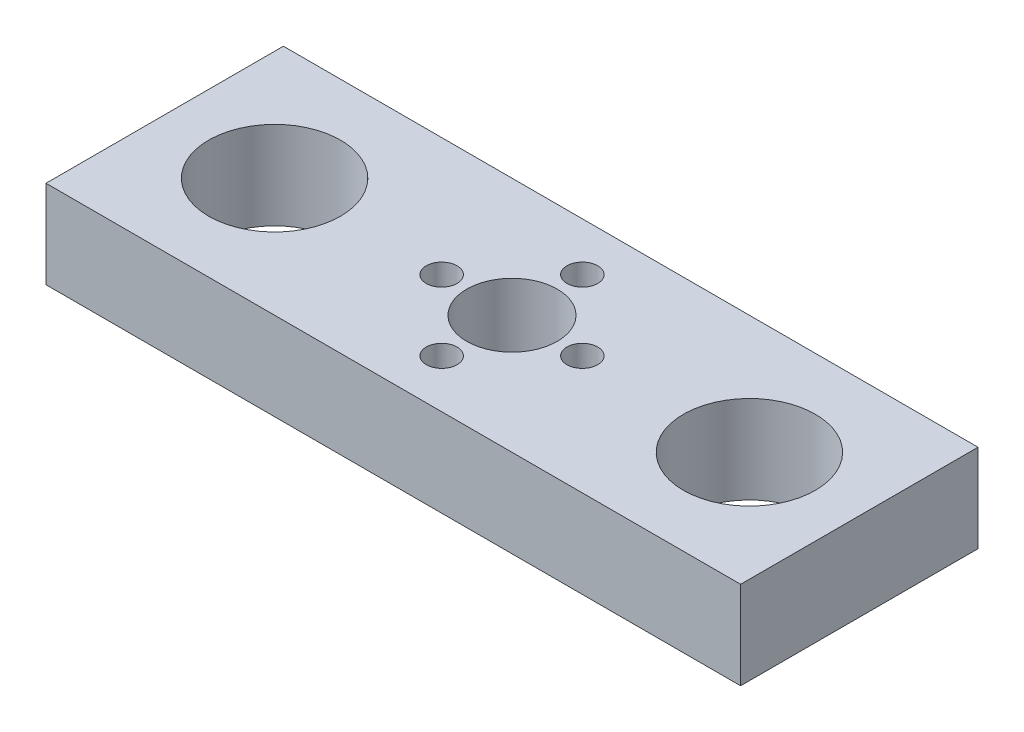
ISO-10303-21;
HEADER;
FILE_DESCRIPTION(('STEP AP214'),'2;1');
FILE_NAME('part.step','',(''),(''),'','','');
FILE_SCHEMA(('AUTOMOTIVE_DESIGN { 1 0 10303 214 1 1 1 1 }'));
ENDSEC;
DATA;
#1=APPLICATION_CONTEXT('core data for automotive mechanical design processes');
#2=APPLICATION_PROTOCOL_DEFINITION('international standard','automotive_design',2000,#1);
#3=PRODUCT_CONTEXT('',#1,'mechanical');
#4=PRODUCT('Part','Part','',(#3));
#5=PRODUCT_RELATED_PRODUCT_CATEGORY('part','',(#4));
#6=PRODUCT_DEFINITION_FORMATION('','',#4);
#7=PRODUCT_DEFINITION_CONTEXT('part definition',#1,'design');
#8=PRODUCT_DEFINITION('design','',#6,#7);
#9=PRODUCT_DEFINITION_SHAPE('','',#8);
#10=(LENGTH_UNIT() NAMED_UNIT(*) SI_UNIT(.MILLI.,.METRE.));
#11=(NAMED_UNIT(*) PLANE_ANGLE_UNIT() SI_UNIT($,.RADIAN.));
#12=(NAMED_UNIT(*) SI_UNIT($,.STERADIAN.) SOLID_ANGLE_UNIT());
#13=UNCERTAINTY_MEASURE_WITH_UNIT(LENGTH_MEASURE(1.E-05),#10,'distance_accuracy_value','');
#14=(GEOMETRIC_REPRESENTATION_CONTEXT(3) GLOBAL_UNCERTAINTY_ASSIGNED_CONTEXT((#13)) GLOBAL_UNIT_ASSIGNED_CONTEXT((#10,
#11,#12)) REPRESENTATION_CONTEXT('',''));
#15=CARTESIAN_POINT('',(0.,0.,0.));
#16=DIRECTION('',(0.,0.,1.));
#17=DIRECTION('',(1.,0.,0.));
#18=AXIS2_PLACEMENT_3D('',#15,#16,#17);
#19=CARTESIAN_POINT('',(39.5,10.,-13.5));
#20=DIRECTION('',(-1.,0.,0.));
#21=DIRECTION('',(0.,0.,1.));
#22=AXIS2_PLACEMENT_3D('',#19,#20,#21);
#23=PLANE('',#22);
#24=DIRECTION('',(0.,0.,-1.));
#25=VECTOR('',#24,1.);
#26=CARTESIAN_POINT('',(39.5,0.,-13.5));
#27=LINE('',#26,#25);
#28=CARTESIAN_POINT('',(39.5,0.,13.5));
#29=VERTEX_POINT('',#28);
#30=CARTESIAN_POINT('',(39.5,0.,-13.5));
#31=VERTEX_POINT('',#30);
#32=EDGE_CURVE('E98',#29,#31,#27,.T.);
#33=ORIENTED_EDGE('',*,*,#32,.T.);
#34=DIRECTION('',(0.,-1.,0.));
#35=VECTOR('',#34,1.);
#36=CARTESIAN_POINT('',(39.5,10.,-13.5));
#37=LINE('',#36,#35);
#38=CARTESIAN_POINT('',(39.5,10.,-13.5));
#39=VERTEX_POINT('',#38);
#40=EDGE_CURVE('E11',#39,#31,#37,.T.);
#41=ORIENTED_EDGE('',*,*,#40,.F.);
#42=DIRECTION('',(0.,0.,-1.));
#43=VECTOR('',#42,1.);
#44=CARTESIAN_POINT('',(39.5,10.,-13.5));
#45=LINE('',#44,#43);
#46=CARTESIAN_POINT('',(39.5,10.,13.5));
#47=VERTEX_POINT('',#46);
#48=EDGE_CURVE('E86',#47,#39,#45,.T.);
#49=ORIENTED_EDGE('',*,*,#48,.F.);
#50=DIRECTION('',(0.,-1.,0.));
#51=VECTOR('',#50,1.);
#52=CARTESIAN_POINT('',(39.5,10.,13.5));
#53=LINE('',#52,#51);
#54=EDGE_CURVE('E94',#47,#29,#53,.T.);
#55=ORIENTED_EDGE('',*,*,#54,.T.);
#56=EDGE_LOOP('',(#33,#41,#49,#55));
#57=FACE_BOUND('',#56,.T.);
#58=ADVANCED_FACE('F35',(#57),#23,.F.);
#59=CARTESIAN_POINT('',(-39.5,10.,-13.5));
#60=DIRECTION('',(0.,0.,1.));
#61=DIRECTION('',(1.,0.,0.));
#62=AXIS2_PLACEMENT_3D('',#59,#60,#61);
#63=PLANE('',#62);
#64=DIRECTION('',(-1.,0.,0.));
#65=VECTOR('',#64,1.);
#66=CARTESIAN_POINT('',(-39.5,0.,-13.5));
#67=LINE('',#66,#65);
#68=CARTESIAN_POINT('',(-39.5,0.,-13.5));
#69=VERTEX_POINT('',#68);
#70=EDGE_CURVE('E90',#31,#69,#67,.T.);
#71=ORIENTED_EDGE('',*,*,#70,.T.);
#72=DIRECTION('',(0.,-1.,0.));
#73=VECTOR('',#72,1.);
#74=CARTESIAN_POINT('',(-39.5,10.,-13.5));
#75=LINE('',#74,#73);
#76=CARTESIAN_POINT('',(-39.5,10.,-13.5));
#77=VERTEX_POINT('',#76);
#78=EDGE_CURVE('E43',#77,#69,#75,.T.);
#79=ORIENTED_EDGE('',*,*,#78,.F.);
#80=DIRECTION('',(-1.,0.,0.));
#81=VECTOR('',#80,1.);
#82=CARTESIAN_POINT('',(-39.5,10.,-13.5));
#83=LINE('',#82,#81);
#84=EDGE_CURVE('E81',#39,#77,#83,.T.);
#85=ORIENTED_EDGE('',*,*,#84,.F.);
#86=ORIENTED_EDGE('',*,*,#40,.T.);
#87=EDGE_LOOP('',(#71,#79,#85,#86));
#88=FACE_BOUND('',#87,.T.);
#89=ADVANCED_FACE('F89',(#88),#63,.F.);
#90=CARTESIAN_POINT('',(-39.5,10.,-13.5));
#91=DIRECTION('',(1.,0.,0.));
#92=DIRECTION('',(0.,0.,-1.));
#93=AXIS2_PLACEMENT_3D('',#90,#91,#92);
#94=PLANE('',#93);
#95=DIRECTION('',(0.,0.,1.));
#96=VECTOR('',#95,1.);
#97=CARTESIAN_POINT('',(-39.5,0.,-13.5));
#98=LINE('',#97,#96);
#99=CARTESIAN_POINT('',(-39.5,0.,13.5));
#100=VERTEX_POINT('',#99);
#101=EDGE_CURVE('E68',#69,#100,#98,.T.);
#102=ORIENTED_EDGE('',*,*,#101,.T.);
#103=DIRECTION('',(0.,-1.,0.));
#104=VECTOR('',#103,1.);
#105=CARTESIAN_POINT('',(-39.5,10.,13.5));
#106=LINE('',#105,#104);
#107=CARTESIAN_POINT('',(-39.5,10.,13.5));
#108=VERTEX_POINT('',#107);
#109=EDGE_CURVE('E91',#108,#100,#106,.T.);
#110=ORIENTED_EDGE('',*,*,#109,.F.);
#111=DIRECTION('',(0.,0.,1.));
#112=VECTOR('',#111,1.);
#113=CARTESIAN_POINT('',(-39.5,10.,-13.5));
#114=LINE('',#113,#112);
#115=EDGE_CURVE('E84',#77,#108,#114,.T.);
#116=ORIENTED_EDGE('',*,*,#115,.F.);
#117=ORIENTED_EDGE('',*,*,#78,.T.);
#118=EDGE_LOOP('',(#102,#110,#116,#117));
#119=FACE_BOUND('',#118,.T.);
#120=ADVANCED_FACE('F92',(#119),#94,.F.);
#121=CARTESIAN_POINT('',(-39.5,10.,13.5));
#122=DIRECTION('',(0.,0.,-1.));
#123=DIRECTION('',(-1.,0.,0.));
#124=AXIS2_PLACEMENT_3D('',#121,#122,#123);
#125=PLANE('',#124);
#126=DIRECTION('',(1.,0.,0.));
#127=VECTOR('',#126,1.);
#128=CARTESIAN_POINT('',(-39.5,0.,13.5));
#129=LINE('',#128,#127);
#130=EDGE_CURVE('E74',#100,#29,#129,.T.);
#131=ORIENTED_EDGE('',*,*,#130,.T.);
#132=ORIENTED_EDGE('',*,*,#54,.F.);
#133=DIRECTION('',(1.,0.,0.));
#134=VECTOR('',#133,1.);
#135=CARTESIAN_POINT('',(-39.5,10.,13.5));
#136=LINE('',#135,#134);
#137=EDGE_CURVE('E51',#108,#47,#136,.T.);
#138=ORIENTED_EDGE('',*,*,#137,.F.);
#139=ORIENTED_EDGE('',*,*,#109,.T.);
#140=EDGE_LOOP('',(#131,#132,#138,#139));
#141=FACE_BOUND('',#140,.T.);
#142=ADVANCED_FACE('F106',(#141),#125,.F.);
#143=CARTESIAN_POINT('',(0.,10.,0.));
#144=DIRECTION('',(0.,1.,0.));
#145=DIRECTION('',(0.,0.,1.));
#146=AXIS2_PLACEMENT_3D('',#143,#144,#145);
#147=PLANE('',#146);
#148=CARTESIAN_POINT('',(8.,10.,0.));
#149=DIRECTION('',(0.,1.,0.));
#150=DIRECTION('',(0.,0.,1.));
#151=AXIS2_PLACEMENT_3D('',#148,#149,#150);
#152=CIRCLE('',#151,1.75);
#153=CARTESIAN_POINT('',(8.,10.,1.75000000000003));
#154=VERTEX_POINT('',#153);
#155=EDGE_CURVE('E148',#154,#154,#152,.T.);
#156=ORIENTED_EDGE('',*,*,#155,.F.);
#157=EDGE_LOOP('',(#156));
#158=FACE_BOUND('',#157,.T.);
#159=CARTESIAN_POINT('',(0.,10.,8.));
#160=DIRECTION('',(0.,1.,0.));
#161=DIRECTION('',(0.,0.,1.));
#162=AXIS2_PLACEMENT_3D('',#159,#160,#161);
#163=CIRCLE('',#162,1.75);
#164=CARTESIAN_POINT('',(0.,10.,9.75));
#165=VERTEX_POINT('',#164);
#166=EDGE_CURVE('E142',#165,#165,#163,.T.);
#167=ORIENTED_EDGE('',*,*,#166,.F.);
#168=EDGE_LOOP('',(#167));
#169=FACE_BOUND('',#168,.T.);
#170=CARTESIAN_POINT('',(-8.,10.,0.));
#171=DIRECTION('',(0.,1.,0.));
#172=DIRECTION('',(0.,0.,1.));
#173=AXIS2_PLACEMENT_3D('',#170,#171,#172);
#174=CIRCLE('',#173,1.75);
#175=CARTESIAN_POINT('',(-8.,10.,1.74999999999992));
#176=VERTEX_POINT('',#175);
#177=EDGE_CURVE('E136',#176,#176,#174,.T.);
#178=ORIENTED_EDGE('',*,*,#177,.F.);
#179=EDGE_LOOP('',(#178));
#180=FACE_BOUND('',#179,.T.);
#181=CARTESIAN_POINT('',(0.,10.,-8.));
#182=DIRECTION('',(0.,1.,0.));
#183=DIRECTION('',(0.,0.,1.));
#184=AXIS2_PLACEMENT_3D('',#181,#182,#183);
#185=CIRCLE('',#184,1.75);
#186=CARTESIAN_POINT('',(0.,10.,-6.25));
#187=VERTEX_POINT('',#186);
#188=EDGE_CURVE('E130',#187,#187,#185,.T.);
#189=ORIENTED_EDGE('',*,*,#188,.F.);
#190=EDGE_LOOP('',(#189));
#191=FACE_BOUND('',#190,.T.);
#192=CARTESIAN_POINT('',(-6.24500451351651E-13,10.,-3.10862446895044E-13));
#193=DIRECTION('',(0.,1.,0.));
#194=DIRECTION('',(0.,0.,1.));
#195=AXIS2_PLACEMENT_3D('',#192,#193,#194);
#196=CIRCLE('',#195,5.15000000000158);
#197=CARTESIAN_POINT('',(-6.24500451351651E-13,10.,5.15000000000127));
#198=VERTEX_POINT('',#197);
#199=EDGE_CURVE('E124',#198,#198,#196,.T.);
#200=ORIENTED_EDGE('',*,*,#199,.F.);
#201=EDGE_LOOP('',(#200));
#202=FACE_BOUND('',#201,.T.);
#203=CARTESIAN_POINT('',(-27.,10.,0.));
#204=DIRECTION('',(0.,1.,0.));
#205=DIRECTION('',(0.,0.,1.));
#206=AXIS2_PLACEMENT_3D('',#203,#204,#205);
#207=CIRCLE('',#206,7.5);
#208=CARTESIAN_POINT('',(-27.,10.,7.5));
#209=VERTEX_POINT('',#208);
#210=EDGE_CURVE('E115',#209,#209,#207,.T.);
#211=ORIENTED_EDGE('',*,*,#210,.F.);
#212=EDGE_LOOP('',(#211));
#213=FACE_BOUND('',#212,.T.);
#214=CARTESIAN_POINT('',(27.,10.,0.));
#215=DIRECTION('',(0.,1.,0.));
#216=DIRECTION('',(0.,0.,1.));
#217=AXIS2_PLACEMENT_3D('',#214,#215,#216);
#218=CIRCLE('',#217,7.5);
#219=CARTESIAN_POINT('',(27.,10.,7.5));
#220=VERTEX_POINT('',#219);
#221=EDGE_CURVE('E112',#220,#220,#218,.T.);
#222=ORIENTED_EDGE('',*,*,#221,.F.);
#223=EDGE_LOOP('',(#222));
#224=FACE_BOUND('',#223,.T.);
#225=ORIENTED_EDGE('',*,*,#48,.T.);
#226=ORIENTED_EDGE('',*,*,#84,.T.);
#227=ORIENTED_EDGE('',*,*,#115,.T.);
#228=ORIENTED_EDGE('',*,*,#137,.T.);
#229=EDGE_LOOP('',(#225,#226,#227,#228));
#230=FACE_BOUND('',#229,.T.);
#231=ADVANCED_FACE('F82',(#158,#169,#180,#191,#202,#213,#224,#230),#147,.T.);
#232=CARTESIAN_POINT('',(0.,0.,0.));
#233=DIRECTION('',(0.,1.,0.));
#234=DIRECTION('',(0.,0.,1.));
#235=AXIS2_PLACEMENT_3D('',#232,#233,#234);
#236=PLANE('',#235);
#237=CARTESIAN_POINT('',(8.,0.,0.));
#238=DIRECTION('',(0.,1.,0.));
#239=DIRECTION('',(0.,0.,1.));
#240=AXIS2_PLACEMENT_3D('',#237,#238,#239);
#241=CIRCLE('',#240,1.75);
#242=CARTESIAN_POINT('',(8.,0.,1.75000000000003));
#243=VERTEX_POINT('',#242);
#244=EDGE_CURVE('E127',#243,#243,#241,.T.);
#245=ORIENTED_EDGE('',*,*,#244,.T.);
#246=EDGE_LOOP('',(#245));
#247=FACE_BOUND('',#246,.T.);
#248=CARTESIAN_POINT('',(0.,0.,8.));
#249=DIRECTION('',(0.,1.,0.));
#250=DIRECTION('',(0.,0.,1.));
#251=AXIS2_PLACEMENT_3D('',#248,#249,#250);
#252=CIRCLE('',#251,1.75);
#253=CARTESIAN_POINT('',(0.,0.,9.75));
#254=VERTEX_POINT('',#253);
#255=EDGE_CURVE('E145',#254,#254,#252,.T.);
#256=ORIENTED_EDGE('',*,*,#255,.T.);
#257=EDGE_LOOP('',(#256));
#258=FACE_BOUND('',#257,.T.);
#259=CARTESIAN_POINT('',(-8.,0.,0.));
#260=DIRECTION('',(0.,1.,0.));
#261=DIRECTION('',(0.,0.,1.));
#262=AXIS2_PLACEMENT_3D('',#259,#260,#261);
#263=CIRCLE('',#262,1.75);
#264=CARTESIAN_POINT('',(-8.,0.,1.74999999999992));
#265=VERTEX_POINT('',#264);
#266=EDGE_CURVE('E139',#265,#265,#263,.T.);
#267=ORIENTED_EDGE('',*,*,#266,.T.);
#268=EDGE_LOOP('',(#267));
#269=FACE_BOUND('',#268,.T.);
#270=CARTESIAN_POINT('',(0.,0.,-8.));
#271=DIRECTION('',(0.,1.,0.));
#272=DIRECTION('',(0.,0.,1.));
#273=AXIS2_PLACEMENT_3D('',#270,#271,#272);
#274=CIRCLE('',#273,1.75);
#275=CARTESIAN_POINT('',(0.,0.,-6.25));
#276=VERTEX_POINT('',#275);
#277=EDGE_CURVE('E133',#276,#276,#274,.T.);
#278=ORIENTED_EDGE('',*,*,#277,.T.);
#279=EDGE_LOOP('',(#278));
#280=FACE_BOUND('',#279,.T.);
#281=CARTESIAN_POINT('',(-6.24500451351651E-13,0.,-3.10862446895044E-13));
#282=DIRECTION('',(0.,1.,0.));
#283=DIRECTION('',(0.,0.,1.));
#284=AXIS2_PLACEMENT_3D('',#281,#282,#283);
#285=CIRCLE('',#284,5.15000000000158);
#286=CARTESIAN_POINT('',(-6.24500451351651E-13,0.,5.15000000000127));
#287=VERTEX_POINT('',#286);
#288=EDGE_CURVE('E121',#287,#287,#285,.T.);
#289=ORIENTED_EDGE('',*,*,#288,.T.);
#290=EDGE_LOOP('',(#289));
#291=FACE_BOUND('',#290,.T.);
#292=CARTESIAN_POINT('',(-27.,0.,0.));
#293=DIRECTION('',(0.,1.,0.));
#294=DIRECTION('',(0.,0.,1.));
#295=AXIS2_PLACEMENT_3D('',#292,#293,#294);
#296=CIRCLE('',#295,7.5);
#297=CARTESIAN_POINT('',(-27.,0.,7.5));
#298=VERTEX_POINT('',#297);
#299=EDGE_CURVE('E118',#298,#298,#296,.T.);
#300=ORIENTED_EDGE('',*,*,#299,.T.);
#301=EDGE_LOOP('',(#300));
#302=FACE_BOUND('',#301,.T.);
#303=CARTESIAN_POINT('',(27.,0.,0.));
#304=DIRECTION('',(0.,1.,0.));
#305=DIRECTION('',(0.,0.,1.));
#306=AXIS2_PLACEMENT_3D('',#303,#304,#305);
#307=CIRCLE('',#306,7.5);
#308=CARTESIAN_POINT('',(27.,0.,7.5));
#309=VERTEX_POINT('',#308);
#310=EDGE_CURVE('E101',#309,#309,#307,.T.);
#311=ORIENTED_EDGE('',*,*,#310,.T.);
#312=EDGE_LOOP('',(#311));
#313=FACE_BOUND('',#312,.T.);
#314=ORIENTED_EDGE('',*,*,#32,.F.);
#315=ORIENTED_EDGE('',*,*,#130,.F.);
#316=ORIENTED_EDGE('',*,*,#101,.F.);
#317=ORIENTED_EDGE('',*,*,#70,.F.);
#318=EDGE_LOOP('',(#314,#315,#316,#317));
#319=FACE_BOUND('',#318,.T.);
#320=ADVANCED_FACE('F109',(#247,#258,#269,#280,#291,#302,#313,#319),#236,.F.);
#321=CARTESIAN_POINT('',(27.,0.,0.));
#322=DIRECTION('',(0.,1.,0.));
#323=DIRECTION('',(0.,0.,1.));
#324=AXIS2_PLACEMENT_3D('',#321,#322,#323);
#325=CYLINDRICAL_SURFACE('',#324,7.5);
#326=ORIENTED_EDGE('',*,*,#310,.F.);
#327=EDGE_LOOP('',(#326));
#328=FACE_BOUND('',#327,.T.);
#329=ORIENTED_EDGE('',*,*,#221,.T.);
#330=EDGE_LOOP('',(#329));
#331=FACE_BOUND('',#330,.T.);
#332=ADVANCED_FACE('F178',(#328,#331),#325,.F.);
#333=CARTESIAN_POINT('',(-27.,0.,0.));
#334=DIRECTION('',(0.,1.,0.));
#335=DIRECTION('',(0.,0.,1.));
#336=AXIS2_PLACEMENT_3D('',#333,#334,#335);
#337=CYLINDRICAL_SURFACE('',#336,7.5);
#338=ORIENTED_EDGE('',*,*,#299,.F.);
#339=EDGE_LOOP('',(#338));
#340=FACE_BOUND('',#339,.T.);
#341=ORIENTED_EDGE('',*,*,#210,.T.);
#342=EDGE_LOOP('',(#341));
#343=FACE_BOUND('',#342,.T.);
#344=ADVANCED_FACE('F180',(#340,#343),#337,.F.);
#345=CARTESIAN_POINT('',(-6.24500451351651E-13,0.,-3.10862446895044E-13));
#346=DIRECTION('',(0.,1.,0.));
#347=DIRECTION('',(0.,0.,1.));
#348=AXIS2_PLACEMENT_3D('',#345,#346,#347);
#349=CYLINDRICAL_SURFACE('',#348,5.15000000000158);
#350=ORIENTED_EDGE('',*,*,#288,.F.);
#351=EDGE_LOOP('',(#350));
#352=FACE_BOUND('',#351,.T.);
#353=ORIENTED_EDGE('',*,*,#199,.T.);
#354=EDGE_LOOP('',(#353));
#355=FACE_BOUND('',#354,.T.);
#356=ADVANCED_FACE('F187',(#352,#355),#349,.F.);
#357=CARTESIAN_POINT('',(0.,0.,-8.));
#358=DIRECTION('',(0.,1.,0.));
#359=DIRECTION('',(0.,0.,1.));
#360=AXIS2_PLACEMENT_3D('',#357,#358,#359);
#361=CYLINDRICAL_SURFACE('',#360,1.75);
#362=ORIENTED_EDGE('',*,*,#277,.F.);
#363=EDGE_LOOP('',(#362));
#364=FACE_BOUND('',#363,.T.);
#365=ORIENTED_EDGE('',*,*,#188,.T.);
#366=EDGE_LOOP('',(#365));
#367=FACE_BOUND('',#366,.T.);
#368=ADVANCED_FACE('F221',(#364,#367),#361,.F.);
#369=CARTESIAN_POINT('',(-8.,0.,0.));
#370=DIRECTION('',(0.,1.,0.));
#371=DIRECTION('',(0.,0.,1.));
#372=AXIS2_PLACEMENT_3D('',#369,#370,#371);
#373=CYLINDRICAL_SURFACE('',#372,1.75);
#374=ORIENTED_EDGE('',*,*,#266,.F.);
#375=EDGE_LOOP('',(#374));
#376=FACE_BOUND('',#375,.T.);
#377=ORIENTED_EDGE('',*,*,#177,.T.);
#378=EDGE_LOOP('',(#377));
#379=FACE_BOUND('',#378,.T.);
#380=ADVANCED_FACE('F226',(#376,#379),#373,.F.);
#381=CARTESIAN_POINT('',(0.,0.,8.));
#382=DIRECTION('',(0.,1.,0.));
#383=DIRECTION('',(0.,0.,1.));
#384=AXIS2_PLACEMENT_3D('',#381,#382,#383);
#385=CYLINDRICAL_SURFACE('',#384,1.75);
#386=ORIENTED_EDGE('',*,*,#255,.F.);
#387=EDGE_LOOP('',(#386));
#388=FACE_BOUND('',#387,.T.);
#389=ORIENTED_EDGE('',*,*,#166,.T.);
#390=EDGE_LOOP('',(#389));
#391=FACE_BOUND('',#390,.T.);
#392=ADVANCED_FACE('F159',(#388,#391),#385,.F.);
#393=CARTESIAN_POINT('',(8.,0.,0.));
#394=DIRECTION('',(0.,1.,0.));
#395=DIRECTION('',(0.,0.,1.));
#396=AXIS2_PLACEMENT_3D('',#393,#394,#395);
#397=CYLINDRICAL_SURFACE('',#396,1.75);
#398=ORIENTED_EDGE('',*,*,#244,.F.);
#399=EDGE_LOOP('',(#398));
#400=FACE_BOUND('',#399,.T.);
#401=ORIENTED_EDGE('',*,*,#155,.T.);
#402=EDGE_LOOP('',(#401));
#403=FACE_BOUND('',#402,.T.);
#404=ADVANCED_FACE('F156',(#400,#403),#397,.F.);
#405=CLOSED_SHELL('',(#58,#89,#120,#142,#231,#320,#332,#344,#356,#368,#380,#392,#404));
#406=MANIFOLD_SOLID_BREP('B2',#405);
#407=ADVANCED_BREP_SHAPE_REPRESENTATION('',(#18,#406),#14);
#408=SHAPE_DEFINITION_REPRESENTATION(#9,#407);
ENDSEC;
END-ISO-10303-21;
